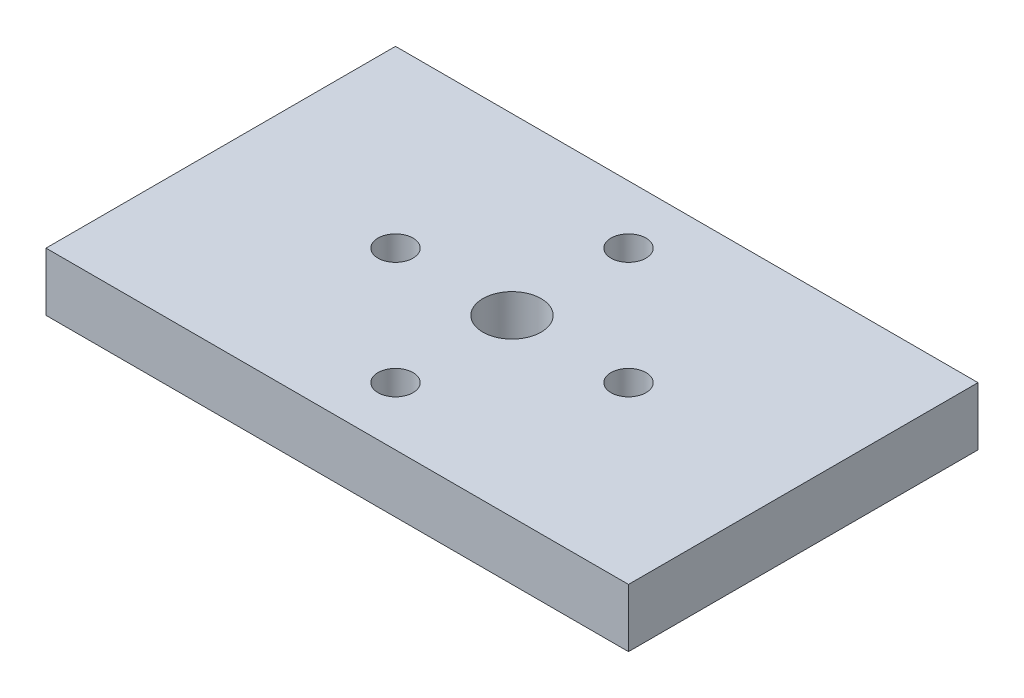
ISO-10303-21;
HEADER;
FILE_DESCRIPTION(('STEP AP214'),'2;1');
FILE_NAME('part.step','',(''),(''),'','','');
FILE_SCHEMA(('AUTOMOTIVE_DESIGN { 1 0 10303 214 1 1 1 1 }'));
ENDSEC;
DATA;
#1=APPLICATION_CONTEXT('core data for automotive mechanical design processes');
#2=APPLICATION_PROTOCOL_DEFINITION('international standard','automotive_design',2000,#1);
#3=PRODUCT_CONTEXT('',#1,'mechanical');
#4=PRODUCT('Part','Part','',(#3));
#5=PRODUCT_RELATED_PRODUCT_CATEGORY('part','',(#4));
#6=PRODUCT_DEFINITION_FORMATION('','',#4);
#7=PRODUCT_DEFINITION_CONTEXT('part definition',#1,'design');
#8=PRODUCT_DEFINITION('design','',#6,#7);
#9=PRODUCT_DEFINITION_SHAPE('','',#8);
#10=(LENGTH_UNIT() NAMED_UNIT(*) SI_UNIT(.MILLI.,.METRE.));
#11=(NAMED_UNIT(*) PLANE_ANGLE_UNIT() SI_UNIT($,.RADIAN.));
#12=(NAMED_UNIT(*) SI_UNIT($,.STERADIAN.) SOLID_ANGLE_UNIT());
#13=UNCERTAINTY_MEASURE_WITH_UNIT(LENGTH_MEASURE(1.E-05),#10,'distance_accuracy_value','');
#14=(GEOMETRIC_REPRESENTATION_CONTEXT(3) GLOBAL_UNCERTAINTY_ASSIGNED_CONTEXT((#13)) GLOBAL_UNIT_ASSIGNED_CONTEXT((#10,
#11,#12)) REPRESENTATION_CONTEXT('',''));
#15=CARTESIAN_POINT('',(0.,0.,0.));
#16=DIRECTION('',(0.,0.,1.));
#17=DIRECTION('',(1.,0.,0.));
#18=AXIS2_PLACEMENT_3D('',#15,#16,#17);
#19=CARTESIAN_POINT('',(50.,10.,30.));
#20=DIRECTION('',(-1.,0.,0.));
#21=DIRECTION('',(0.,0.,1.));
#22=AXIS2_PLACEMENT_3D('',#19,#20,#21);
#23=PLANE('',#22);
#24=DIRECTION('',(0.,0.,-1.));
#25=VECTOR('',#24,1.);
#26=CARTESIAN_POINT('',(50.,0.,30.));
#27=LINE('',#26,#25);
#28=CARTESIAN_POINT('',(50.,0.,30.));
#29=VERTEX_POINT('',#28);
#30=CARTESIAN_POINT('',(50.,0.,-30.));
#31=VERTEX_POINT('',#30);
#32=EDGE_CURVE('E102',#29,#31,#27,.T.);
#33=ORIENTED_EDGE('',*,*,#32,.T.);
#34=DIRECTION('',(0.,-1.,0.));
#35=VECTOR('',#34,1.);
#36=CARTESIAN_POINT('',(50.,10.,-30.));
#37=LINE('',#36,#35);
#38=CARTESIAN_POINT('',(50.,10.,-30.));
#39=VERTEX_POINT('',#38);
#40=EDGE_CURVE('E11',#39,#31,#37,.T.);
#41=ORIENTED_EDGE('',*,*,#40,.F.);
#42=DIRECTION('',(0.,0.,-1.));
#43=VECTOR('',#42,1.);
#44=CARTESIAN_POINT('',(50.,10.,30.));
#45=LINE('',#44,#43);
#46=CARTESIAN_POINT('',(50.,10.,30.));
#47=VERTEX_POINT('',#46);
#48=EDGE_CURVE('E90',#47,#39,#45,.T.);
#49=ORIENTED_EDGE('',*,*,#48,.F.);
#50=DIRECTION('',(0.,-1.,0.));
#51=VECTOR('',#50,1.);
#52=CARTESIAN_POINT('',(50.,10.,30.));
#53=LINE('',#52,#51);
#54=EDGE_CURVE('E98',#47,#29,#53,.T.);
#55=ORIENTED_EDGE('',*,*,#54,.T.);
#56=EDGE_LOOP('',(#33,#41,#49,#55));
#57=FACE_BOUND('',#56,.T.);
#58=ADVANCED_FACE('F39',(#57),#23,.F.);
#59=CARTESIAN_POINT('',(-50.,10.,-30.));
#60=DIRECTION('',(0.,0.,1.));
#61=DIRECTION('',(1.,0.,0.));
#62=AXIS2_PLACEMENT_3D('',#59,#60,#61);
#63=PLANE('',#62);
#64=DIRECTION('',(-1.,0.,0.));
#65=VECTOR('',#64,1.);
#66=CARTESIAN_POINT('',(-50.,0.,-30.));
#67=LINE('',#66,#65);
#68=CARTESIAN_POINT('',(-50.,0.,-30.));
#69=VERTEX_POINT('',#68);
#70=EDGE_CURVE('E94',#31,#69,#67,.T.);
#71=ORIENTED_EDGE('',*,*,#70,.T.);
#72=DIRECTION('',(0.,-1.,0.));
#73=VECTOR('',#72,1.);
#74=CARTESIAN_POINT('',(-50.,10.,-30.));
#75=LINE('',#74,#73);
#76=CARTESIAN_POINT('',(-50.,10.,-30.));
#77=VERTEX_POINT('',#76);
#78=EDGE_CURVE('E47',#77,#69,#75,.T.);
#79=ORIENTED_EDGE('',*,*,#78,.F.);
#80=DIRECTION('',(-1.,0.,0.));
#81=VECTOR('',#80,1.);
#82=CARTESIAN_POINT('',(-50.,10.,-30.));
#83=LINE('',#82,#81);
#84=EDGE_CURVE('E85',#39,#77,#83,.T.);
#85=ORIENTED_EDGE('',*,*,#84,.F.);
#86=ORIENTED_EDGE('',*,*,#40,.T.);
#87=EDGE_LOOP('',(#71,#79,#85,#86));
#88=FACE_BOUND('',#87,.T.);
#89=ADVANCED_FACE('F93',(#88),#63,.F.);
#90=CARTESIAN_POINT('',(-50.,10.,30.));
#91=DIRECTION('',(1.,0.,0.));
#92=DIRECTION('',(0.,0.,-1.));
#93=AXIS2_PLACEMENT_3D('',#90,#91,#92);
#94=PLANE('',#93);
#95=DIRECTION('',(0.,0.,1.));
#96=VECTOR('',#95,1.);
#97=CARTESIAN_POINT('',(-50.,0.,30.));
#98=LINE('',#97,#96);
#99=CARTESIAN_POINT('',(-50.,0.,30.));
#100=VERTEX_POINT('',#99);
#101=EDGE_CURVE('E72',#69,#100,#98,.T.);
#102=ORIENTED_EDGE('',*,*,#101,.T.);
#103=DIRECTION('',(0.,-1.,0.));
#104=VECTOR('',#103,1.);
#105=CARTESIAN_POINT('',(-50.,10.,30.));
#106=LINE('',#105,#104);
#107=CARTESIAN_POINT('',(-50.,10.,30.));
#108=VERTEX_POINT('',#107);
#109=EDGE_CURVE('E95',#108,#100,#106,.T.);
#110=ORIENTED_EDGE('',*,*,#109,.F.);
#111=DIRECTION('',(0.,0.,1.));
#112=VECTOR('',#111,1.);
#113=CARTESIAN_POINT('',(-50.,10.,30.));
#114=LINE('',#113,#112);
#115=EDGE_CURVE('E88',#77,#108,#114,.T.);
#116=ORIENTED_EDGE('',*,*,#115,.F.);
#117=ORIENTED_EDGE('',*,*,#78,.T.);
#118=EDGE_LOOP('',(#102,#110,#116,#117));
#119=FACE_BOUND('',#118,.T.);
#120=ADVANCED_FACE('F96',(#119),#94,.F.);
#121=CARTESIAN_POINT('',(-50.,10.,30.));
#122=DIRECTION('',(0.,0.,-1.));
#123=DIRECTION('',(-1.,0.,0.));
#124=AXIS2_PLACEMENT_3D('',#121,#122,#123);
#125=PLANE('',#124);
#126=DIRECTION('',(1.,0.,0.));
#127=VECTOR('',#126,1.);
#128=CARTESIAN_POINT('',(-50.,0.,30.));
#129=LINE('',#128,#127);
#130=EDGE_CURVE('E78',#100,#29,#129,.T.);
#131=ORIENTED_EDGE('',*,*,#130,.T.);
#132=ORIENTED_EDGE('',*,*,#54,.F.);
#133=DIRECTION('',(1.,0.,0.));
#134=VECTOR('',#133,1.);
#135=CARTESIAN_POINT('',(-50.,10.,30.));
#136=LINE('',#135,#134);
#137=EDGE_CURVE('E55',#108,#47,#136,.T.);
#138=ORIENTED_EDGE('',*,*,#137,.F.);
#139=ORIENTED_EDGE('',*,*,#109,.T.);
#140=EDGE_LOOP('',(#131,#132,#138,#139));
#141=FACE_BOUND('',#140,.T.);
#142=ADVANCED_FACE('F110',(#141),#125,.F.);
#143=CARTESIAN_POINT('',(0.,10.,0.));
#144=DIRECTION('',(0.,-1.,0.));
#145=DIRECTION('',(0.,0.,-1.));
#146=AXIS2_PLACEMENT_3D('',#143,#144,#145);
#147=PLANE('',#146);
#148=CARTESIAN_POINT('',(0.,10.,-20.));
#149=DIRECTION('',(0.,-1.,0.));
#150=DIRECTION('',(0.,0.,-1.));
#151=AXIS2_PLACEMENT_3D('',#148,#149,#150);
#152=CIRCLE('',#151,3.);
#153=CARTESIAN_POINT('',(0.,10.,-23.));
#154=VERTEX_POINT('',#153);
#155=EDGE_CURVE('E127',#154,#154,#152,.F.);
#156=ORIENTED_EDGE('',*,*,#155,.F.);
#157=EDGE_LOOP('',(#156));
#158=FACE_BOUND('',#157,.T.);
#159=CARTESIAN_POINT('',(-20.,10.,0.));
#160=DIRECTION('',(0.,-1.,0.));
#161=DIRECTION('',(0.,0.,-1.));
#162=AXIS2_PLACEMENT_3D('',#159,#160,#161);
#163=CIRCLE('',#162,3.);
#164=CARTESIAN_POINT('',(-20.,10.,-3.));
#165=VERTEX_POINT('',#164);
#166=EDGE_CURVE('E130',#165,#165,#163,.F.);
#167=ORIENTED_EDGE('',*,*,#166,.F.);
#168=EDGE_LOOP('',(#167));
#169=FACE_BOUND('',#168,.T.);
#170=CARTESIAN_POINT('',(0.,10.,20.));
#171=DIRECTION('',(0.,-1.,0.));
#172=DIRECTION('',(0.,0.,-1.));
#173=AXIS2_PLACEMENT_3D('',#170,#171,#172);
#174=CIRCLE('',#173,3.);
#175=CARTESIAN_POINT('',(0.,10.,17.));
#176=VERTEX_POINT('',#175);
#177=EDGE_CURVE('E133',#176,#176,#174,.F.);
#178=ORIENTED_EDGE('',*,*,#177,.F.);
#179=EDGE_LOOP('',(#178));
#180=FACE_BOUND('',#179,.T.);
#181=CARTESIAN_POINT('',(20.,10.,0.));
#182=DIRECTION('',(0.,-1.,0.));
#183=DIRECTION('',(0.,0.,-1.));
#184=AXIS2_PLACEMENT_3D('',#181,#182,#183);
#185=CIRCLE('',#184,3.);
#186=CARTESIAN_POINT('',(20.,10.,-3.));
#187=VERTEX_POINT('',#186);
#188=EDGE_CURVE('E121',#187,#187,#185,.F.);
#189=ORIENTED_EDGE('',*,*,#188,.F.);
#190=EDGE_LOOP('',(#189));
#191=FACE_BOUND('',#190,.T.);
#192=CARTESIAN_POINT('',(0.,10.,0.));
#193=DIRECTION('',(0.,-1.,0.));
#194=DIRECTION('',(0.,0.,-1.));
#195=AXIS2_PLACEMENT_3D('',#192,#193,#194);
#196=CIRCLE('',#195,5.);
#197=CARTESIAN_POINT('',(0.,10.,-5.));
#198=VERTEX_POINT('',#197);
#199=EDGE_CURVE('E105',#198,#198,#196,.F.);
#200=ORIENTED_EDGE('',*,*,#199,.F.);
#201=EDGE_LOOP('',(#200));
#202=FACE_BOUND('',#201,.T.);
#203=ORIENTED_EDGE('',*,*,#48,.T.);
#204=ORIENTED_EDGE('',*,*,#84,.T.);
#205=ORIENTED_EDGE('',*,*,#115,.T.);
#206=ORIENTED_EDGE('',*,*,#137,.T.);
#207=EDGE_LOOP('',(#203,#204,#205,#206));
#208=FACE_BOUND('',#207,.T.);
#209=ADVANCED_FACE('F86',(#158,#169,#180,#191,#202,#208),#147,.F.);
#210=CARTESIAN_POINT('',(0.,0.,0.));
#211=DIRECTION('',(0.,-1.,0.));
#212=DIRECTION('',(0.,0.,-1.));
#213=AXIS2_PLACEMENT_3D('',#210,#211,#212);
#214=PLANE('',#213);
#215=CARTESIAN_POINT('',(0.,0.,-20.));
#216=DIRECTION('',(0.,1.,0.));
#217=DIRECTION('',(1.,0.,0.));
#218=AXIS2_PLACEMENT_3D('',#215,#216,#217);
#219=CIRCLE('',#218,3.);
#220=CARTESIAN_POINT('',(3.,0.,-20.));
#221=VERTEX_POINT('',#220);
#222=EDGE_CURVE('E136',#221,#221,#219,.T.);
#223=ORIENTED_EDGE('',*,*,#222,.T.);
#224=EDGE_LOOP('',(#223));
#225=FACE_BOUND('',#224,.T.);
#226=CARTESIAN_POINT('',(-20.,0.,0.));
#227=DIRECTION('',(0.,1.,0.));
#228=DIRECTION('',(0.,0.,-1.));
#229=AXIS2_PLACEMENT_3D('',#226,#227,#228);
#230=CIRCLE('',#229,3.);
#231=CARTESIAN_POINT('',(-20.,0.,-3.));
#232=VERTEX_POINT('',#231);
#233=EDGE_CURVE('E140',#232,#232,#230,.T.);
#234=ORIENTED_EDGE('',*,*,#233,.T.);
#235=EDGE_LOOP('',(#234));
#236=FACE_BOUND('',#235,.T.);
#237=CARTESIAN_POINT('',(0.,0.,20.));
#238=DIRECTION('',(0.,1.,0.));
#239=DIRECTION('',(-1.,0.,0.));
#240=AXIS2_PLACEMENT_3D('',#237,#238,#239);
#241=CIRCLE('',#240,3.);
#242=CARTESIAN_POINT('',(-3.,0.,20.));
#243=VERTEX_POINT('',#242);
#244=EDGE_CURVE('E137',#243,#243,#241,.T.);
#245=ORIENTED_EDGE('',*,*,#244,.T.);
#246=EDGE_LOOP('',(#245));
#247=FACE_BOUND('',#246,.T.);
#248=CARTESIAN_POINT('',(20.,0.,0.));
#249=DIRECTION('',(0.,1.,0.));
#250=DIRECTION('',(0.,0.,1.));
#251=AXIS2_PLACEMENT_3D('',#248,#249,#250);
#252=CIRCLE('',#251,3.);
#253=CARTESIAN_POINT('',(20.,0.,3.));
#254=VERTEX_POINT('',#253);
#255=EDGE_CURVE('E124',#254,#254,#252,.T.);
#256=ORIENTED_EDGE('',*,*,#255,.T.);
#257=EDGE_LOOP('',(#256));
#258=FACE_BOUND('',#257,.T.);
#259=CARTESIAN_POINT('',(0.,0.,0.));
#260=DIRECTION('',(0.,1.,0.));
#261=DIRECTION('',(0.,0.,1.));
#262=AXIS2_PLACEMENT_3D('',#259,#260,#261);
#263=CIRCLE('',#262,5.);
#264=CARTESIAN_POINT('',(0.,0.,5.));
#265=VERTEX_POINT('',#264);
#266=EDGE_CURVE('E118',#265,#265,#263,.T.);
#267=ORIENTED_EDGE('',*,*,#266,.T.);
#268=EDGE_LOOP('',(#267));
#269=FACE_BOUND('',#268,.T.);
#270=ORIENTED_EDGE('',*,*,#32,.F.);
#271=ORIENTED_EDGE('',*,*,#130,.F.);
#272=ORIENTED_EDGE('',*,*,#101,.F.);
#273=ORIENTED_EDGE('',*,*,#70,.F.);
#274=EDGE_LOOP('',(#270,#271,#272,#273));
#275=FACE_BOUND('',#274,.T.);
#276=ADVANCED_FACE('F113',(#225,#236,#247,#258,#269,#275),#214,.T.);
#277=CARTESIAN_POINT('',(0.,20.,0.));
#278=DIRECTION('',(0.,-1.,0.));
#279=DIRECTION('',(0.,0.,-1.));
#280=AXIS2_PLACEMENT_3D('',#277,#278,#279);
#281=CYLINDRICAL_SURFACE('',#280,5.);
#282=ORIENTED_EDGE('',*,*,#266,.F.);
#283=EDGE_LOOP('',(#282));
#284=FACE_BOUND('',#283,.T.);
#285=ORIENTED_EDGE('',*,*,#199,.T.);
#286=EDGE_LOOP('',(#285));
#287=FACE_BOUND('',#286,.T.);
#288=ADVANCED_FACE('F166',(#284,#287),#281,.F.);
#289=CARTESIAN_POINT('',(20.,20.,0.));
#290=DIRECTION('',(0.,-1.,0.));
#291=DIRECTION('',(0.,0.,-1.));
#292=AXIS2_PLACEMENT_3D('',#289,#290,#291);
#293=CYLINDRICAL_SURFACE('',#292,3.);
#294=ORIENTED_EDGE('',*,*,#255,.F.);
#295=EDGE_LOOP('',(#294));
#296=FACE_BOUND('',#295,.T.);
#297=ORIENTED_EDGE('',*,*,#188,.T.);
#298=EDGE_LOOP('',(#297));
#299=FACE_BOUND('',#298,.T.);
#300=ADVANCED_FACE('F168',(#296,#299),#293,.F.);
#301=CARTESIAN_POINT('',(0.,20.,20.));
#302=DIRECTION('',(0.,-1.,0.));
#303=DIRECTION('',(0.,0.,-1.));
#304=AXIS2_PLACEMENT_3D('',#301,#302,#303);
#305=CYLINDRICAL_SURFACE('',#304,3.);
#306=ORIENTED_EDGE('',*,*,#244,.F.);
#307=EDGE_LOOP('',(#306));
#308=FACE_BOUND('',#307,.T.);
#309=ORIENTED_EDGE('',*,*,#177,.T.);
#310=EDGE_LOOP('',(#309));
#311=FACE_BOUND('',#310,.T.);
#312=ADVANCED_FACE('F175',(#308,#311),#305,.F.);
#313=CARTESIAN_POINT('',(-20.,20.,0.));
#314=DIRECTION('',(0.,-1.,0.));
#315=DIRECTION('',(0.,0.,-1.));
#316=AXIS2_PLACEMENT_3D('',#313,#314,#315);
#317=CYLINDRICAL_SURFACE('',#316,3.);
#318=ORIENTED_EDGE('',*,*,#233,.F.);
#319=EDGE_LOOP('',(#318));
#320=FACE_BOUND('',#319,.T.);
#321=ORIENTED_EDGE('',*,*,#166,.T.);
#322=EDGE_LOOP('',(#321));
#323=FACE_BOUND('',#322,.T.);
#324=ADVANCED_FACE('F151',(#320,#323),#317,.F.);
#325=CARTESIAN_POINT('',(0.,20.,-20.));
#326=DIRECTION('',(0.,-1.,0.));
#327=DIRECTION('',(0.,0.,-1.));
#328=AXIS2_PLACEMENT_3D('',#325,#326,#327);
#329=CYLINDRICAL_SURFACE('',#328,3.);
#330=ORIENTED_EDGE('',*,*,#222,.F.);
#331=EDGE_LOOP('',(#330));
#332=FACE_BOUND('',#331,.T.);
#333=ORIENTED_EDGE('',*,*,#155,.T.);
#334=EDGE_LOOP('',(#333));
#335=FACE_BOUND('',#334,.T.);
#336=ADVANCED_FACE('F148',(#332,#335),#329,.F.);
#337=CLOSED_SHELL('',(#58,#89,#120,#142,#209,#276,#288,#300,#312,#324,#336));
#338=MANIFOLD_SOLID_BREP('B2',#337);
#339=ADVANCED_BREP_SHAPE_REPRESENTATION('',(#18,#338),#14);
#340=SHAPE_DEFINITION_REPRESENTATION(#9,#339);
ENDSEC;
END-ISO-10303-21;
